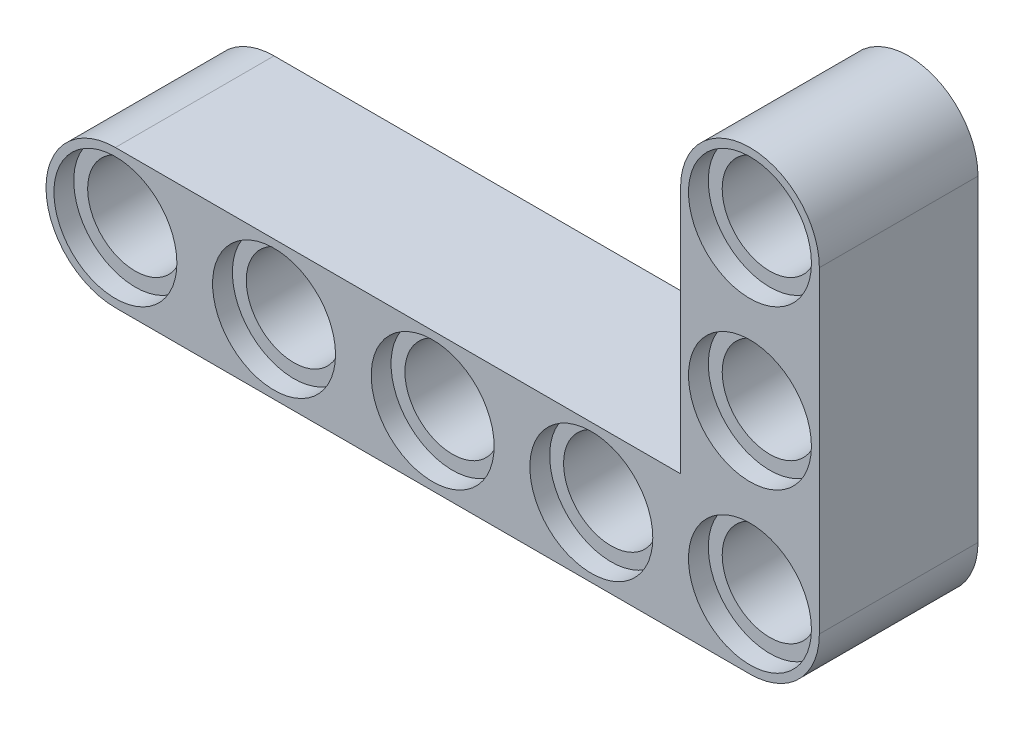
ISO-10303-21;
HEADER;
FILE_DESCRIPTION(('STEP AP214'),'2;1');
FILE_NAME('part.step','',(''),(''),'','','');
FILE_SCHEMA(('AUTOMOTIVE_DESIGN { 1 0 10303 214 1 1 1 1 }'));
ENDSEC;
DATA;
#1=APPLICATION_CONTEXT('core data for automotive mechanical design processes');
#2=APPLICATION_PROTOCOL_DEFINITION('international standard','automotive_design',2000,#1);
#3=PRODUCT_CONTEXT('',#1,'mechanical');
#4=PRODUCT('Part','Part','',(#3));
#5=PRODUCT_RELATED_PRODUCT_CATEGORY('part','',(#4));
#6=PRODUCT_DEFINITION_FORMATION('','',#4);
#7=PRODUCT_DEFINITION_CONTEXT('part definition',#1,'design');
#8=PRODUCT_DEFINITION('design','',#6,#7);
#9=PRODUCT_DEFINITION_SHAPE('','',#8);
#10=(LENGTH_UNIT() NAMED_UNIT(*) SI_UNIT(.MILLI.,.METRE.));
#11=(NAMED_UNIT(*) PLANE_ANGLE_UNIT() SI_UNIT($,.RADIAN.));
#12=(NAMED_UNIT(*) SI_UNIT($,.STERADIAN.) SOLID_ANGLE_UNIT());
#13=UNCERTAINTY_MEASURE_WITH_UNIT(LENGTH_MEASURE(1.E-05),#10,'distance_accuracy_value','');
#14=(GEOMETRIC_REPRESENTATION_CONTEXT(3) GLOBAL_UNCERTAINTY_ASSIGNED_CONTEXT((#13)) GLOBAL_UNIT_ASSIGNED_CONTEXT((#10,
#11,#12)) REPRESENTATION_CONTEXT('',''));
#15=CARTESIAN_POINT('',(0.,0.,0.));
#16=DIRECTION('',(0.,0.,1.));
#17=DIRECTION('',(1.,0.,0.));
#18=AXIS2_PLACEMENT_3D('',#15,#16,#17);
#19=CARTESIAN_POINT('',(0.,0.,4.));
#20=DIRECTION('',(0.,0.,-1.));
#21=DIRECTION('',(-1.,0.,0.));
#22=AXIS2_PLACEMENT_3D('',#19,#20,#21);
#23=CYLINDRICAL_SURFACE('',#22,2.4);
#24=CARTESIAN_POINT('',(0.,0.,3.));
#25=DIRECTION('',(0.,0.,1.));
#26=DIRECTION('',(1.,0.,0.));
#27=AXIS2_PLACEMENT_3D('',#24,#25,#26);
#28=CIRCLE('',#27,2.4);
#29=CARTESIAN_POINT('',(2.4,0.,3.));
#30=VERTEX_POINT('',#29);
#31=EDGE_CURVE('E142',#30,#30,#28,.T.);
#32=ORIENTED_EDGE('',*,*,#31,.T.);
#33=EDGE_LOOP('',(#32));
#34=FACE_BOUND('',#33,.T.);
#35=CARTESIAN_POINT('',(0.,0.,-3.));
#36=DIRECTION('',(0.,0.,-1.));
#37=DIRECTION('',(-1.,0.,0.));
#38=AXIS2_PLACEMENT_3D('',#35,#36,#37);
#39=CIRCLE('',#38,2.4);
#40=CARTESIAN_POINT('',(-2.4,0.,-3.));
#41=VERTEX_POINT('',#40);
#42=EDGE_CURVE('E43',#41,#41,#39,.T.);
#43=ORIENTED_EDGE('',*,*,#42,.T.);
#44=EDGE_LOOP('',(#43));
#45=FACE_BOUND('',#44,.T.);
#46=ADVANCED_FACE('F39',(#34,#45),#23,.F.);
#47=CARTESIAN_POINT('',(8.,0.,4.));
#48=DIRECTION('',(0.,0.,-1.));
#49=DIRECTION('',(-1.,0.,0.));
#50=AXIS2_PLACEMENT_3D('',#47,#48,#49);
#51=CYLINDRICAL_SURFACE('',#50,2.4);
#52=CARTESIAN_POINT('',(8.,0.,3.));
#53=DIRECTION('',(0.,0.,1.));
#54=DIRECTION('',(1.,0.,0.));
#55=AXIS2_PLACEMENT_3D('',#52,#53,#54);
#56=CIRCLE('',#55,2.4);
#57=CARTESIAN_POINT('',(10.4,0.,3.));
#58=VERTEX_POINT('',#57);
#59=EDGE_CURVE('E192',#58,#58,#56,.T.);
#60=ORIENTED_EDGE('',*,*,#59,.T.);
#61=EDGE_LOOP('',(#60));
#62=FACE_BOUND('',#61,.T.);
#63=CARTESIAN_POINT('',(8.,0.,-3.));
#64=DIRECTION('',(0.,0.,-1.));
#65=DIRECTION('',(-1.,0.,0.));
#66=AXIS2_PLACEMENT_3D('',#63,#64,#65);
#67=CIRCLE('',#66,2.4);
#68=CARTESIAN_POINT('',(5.6,0.,-3.));
#69=VERTEX_POINT('',#68);
#70=EDGE_CURVE('E219',#69,#69,#67,.T.);
#71=ORIENTED_EDGE('',*,*,#70,.T.);
#72=EDGE_LOOP('',(#71));
#73=FACE_BOUND('',#72,.T.);
#74=ADVANCED_FACE('F366',(#62,#73),#51,.F.);
#75=CARTESIAN_POINT('',(16.,0.,4.));
#76=DIRECTION('',(0.,0.,-1.));
#77=DIRECTION('',(-1.,0.,0.));
#78=AXIS2_PLACEMENT_3D('',#75,#76,#77);
#79=CYLINDRICAL_SURFACE('',#78,2.4);
#80=CARTESIAN_POINT('',(16.,0.,3.));
#81=DIRECTION('',(0.,0.,1.));
#82=DIRECTION('',(1.,0.,0.));
#83=AXIS2_PLACEMENT_3D('',#80,#81,#82);
#84=CIRCLE('',#83,2.4);
#85=CARTESIAN_POINT('',(18.4,0.,3.));
#86=VERTEX_POINT('',#85);
#87=EDGE_CURVE('E188',#86,#86,#84,.T.);
#88=ORIENTED_EDGE('',*,*,#87,.T.);
#89=EDGE_LOOP('',(#88));
#90=FACE_BOUND('',#89,.T.);
#91=CARTESIAN_POINT('',(16.,0.,-3.));
#92=DIRECTION('',(0.,0.,-1.));
#93=DIRECTION('',(-1.,0.,0.));
#94=AXIS2_PLACEMENT_3D('',#91,#92,#93);
#95=CIRCLE('',#94,2.4);
#96=CARTESIAN_POINT('',(13.6,0.,-3.));
#97=VERTEX_POINT('',#96);
#98=EDGE_CURVE('E216',#97,#97,#95,.T.);
#99=ORIENTED_EDGE('',*,*,#98,.T.);
#100=EDGE_LOOP('',(#99));
#101=FACE_BOUND('',#100,.T.);
#102=ADVANCED_FACE('F372',(#90,#101),#79,.F.);
#103=CARTESIAN_POINT('',(-8.,0.,4.));
#104=DIRECTION('',(0.,0.,-1.));
#105=DIRECTION('',(-1.,0.,0.));
#106=AXIS2_PLACEMENT_3D('',#103,#104,#105);
#107=CYLINDRICAL_SURFACE('',#106,2.4);
#108=CARTESIAN_POINT('',(-8.,0.,3.));
#109=DIRECTION('',(0.,0.,1.));
#110=DIRECTION('',(1.,0.,0.));
#111=AXIS2_PLACEMENT_3D('',#108,#109,#110);
#112=CIRCLE('',#111,2.4);
#113=CARTESIAN_POINT('',(-5.6,0.,3.));
#114=VERTEX_POINT('',#113);
#115=EDGE_CURVE('E184',#114,#114,#112,.T.);
#116=ORIENTED_EDGE('',*,*,#115,.T.);
#117=EDGE_LOOP('',(#116));
#118=FACE_BOUND('',#117,.T.);
#119=CARTESIAN_POINT('',(-8.,0.,-3.));
#120=DIRECTION('',(0.,0.,-1.));
#121=DIRECTION('',(-1.,0.,0.));
#122=AXIS2_PLACEMENT_3D('',#119,#120,#121);
#123=CIRCLE('',#122,2.4);
#124=CARTESIAN_POINT('',(-10.4,0.,-3.));
#125=VERTEX_POINT('',#124);
#126=EDGE_CURVE('E212',#125,#125,#123,.T.);
#127=ORIENTED_EDGE('',*,*,#126,.T.);
#128=EDGE_LOOP('',(#127));
#129=FACE_BOUND('',#128,.T.);
#130=ADVANCED_FACE('F449',(#118,#129),#107,.F.);
#131=CARTESIAN_POINT('',(-16.,0.,4.));
#132=DIRECTION('',(0.,0.,-1.));
#133=DIRECTION('',(-1.,0.,0.));
#134=AXIS2_PLACEMENT_3D('',#131,#132,#133);
#135=CYLINDRICAL_SURFACE('',#134,2.4);
#136=CARTESIAN_POINT('',(-16.,0.,3.));
#137=DIRECTION('',(0.,0.,1.));
#138=DIRECTION('',(1.,0.,0.));
#139=AXIS2_PLACEMENT_3D('',#136,#137,#138);
#140=CIRCLE('',#139,2.4);
#141=CARTESIAN_POINT('',(-13.6,0.,3.));
#142=VERTEX_POINT('',#141);
#143=EDGE_CURVE('E180',#142,#142,#140,.T.);
#144=ORIENTED_EDGE('',*,*,#143,.T.);
#145=EDGE_LOOP('',(#144));
#146=FACE_BOUND('',#145,.T.);
#147=CARTESIAN_POINT('',(-16.,0.,-3.));
#148=DIRECTION('',(0.,0.,-1.));
#149=DIRECTION('',(-1.,0.,0.));
#150=AXIS2_PLACEMENT_3D('',#147,#148,#149);
#151=CIRCLE('',#150,2.4);
#152=CARTESIAN_POINT('',(-18.4,0.,-3.));
#153=VERTEX_POINT('',#152);
#154=EDGE_CURVE('E208',#153,#153,#151,.T.);
#155=ORIENTED_EDGE('',*,*,#154,.T.);
#156=EDGE_LOOP('',(#155));
#157=FACE_BOUND('',#156,.T.);
#158=ADVANCED_FACE('F441',(#146,#157),#135,.F.);
#159=CARTESIAN_POINT('',(16.,8.,4.));
#160=DIRECTION('',(0.,0.,-1.));
#161=DIRECTION('',(-1.,0.,0.));
#162=AXIS2_PLACEMENT_3D('',#159,#160,#161);
#163=CYLINDRICAL_SURFACE('',#162,2.4);
#164=CARTESIAN_POINT('',(16.,8.,3.));
#165=DIRECTION('',(0.,0.,1.));
#166=DIRECTION('',(1.,0.,0.));
#167=AXIS2_PLACEMENT_3D('',#164,#165,#166);
#168=CIRCLE('',#167,2.4);
#169=CARTESIAN_POINT('',(18.4,8.,3.));
#170=VERTEX_POINT('',#169);
#171=EDGE_CURVE('E175',#170,#170,#168,.T.);
#172=ORIENTED_EDGE('',*,*,#171,.T.);
#173=EDGE_LOOP('',(#172));
#174=FACE_BOUND('',#173,.T.);
#175=CARTESIAN_POINT('',(16.,8.,-3.));
#176=DIRECTION('',(0.,0.,-1.));
#177=DIRECTION('',(-1.,0.,0.));
#178=AXIS2_PLACEMENT_3D('',#175,#176,#177);
#179=CIRCLE('',#178,2.4);
#180=CARTESIAN_POINT('',(13.6,8.,-3.));
#181=VERTEX_POINT('',#180);
#182=EDGE_CURVE('E203',#181,#181,#179,.T.);
#183=ORIENTED_EDGE('',*,*,#182,.T.);
#184=EDGE_LOOP('',(#183));
#185=FACE_BOUND('',#184,.T.);
#186=ADVANCED_FACE('F433',(#174,#185),#163,.F.);
#187=CARTESIAN_POINT('',(16.,16.,4.));
#188=DIRECTION('',(0.,0.,-1.));
#189=DIRECTION('',(-1.,0.,0.));
#190=AXIS2_PLACEMENT_3D('',#187,#188,#189);
#191=CYLINDRICAL_SURFACE('',#190,2.4);
#192=CARTESIAN_POINT('',(16.,16.,3.));
#193=DIRECTION('',(0.,0.,1.));
#194=DIRECTION('',(1.,0.,0.));
#195=AXIS2_PLACEMENT_3D('',#192,#193,#194);
#196=CIRCLE('',#195,2.4);
#197=CARTESIAN_POINT('',(18.4,16.,3.));
#198=VERTEX_POINT('',#197);
#199=EDGE_CURVE('E171',#198,#198,#196,.T.);
#200=ORIENTED_EDGE('',*,*,#199,.T.);
#201=EDGE_LOOP('',(#200));
#202=FACE_BOUND('',#201,.T.);
#203=CARTESIAN_POINT('',(16.,16.,-3.));
#204=DIRECTION('',(0.,0.,-1.));
#205=DIRECTION('',(-1.,0.,0.));
#206=AXIS2_PLACEMENT_3D('',#203,#204,#205);
#207=CIRCLE('',#206,2.4);
#208=CARTESIAN_POINT('',(13.6,16.,-3.));
#209=VERTEX_POINT('',#208);
#210=EDGE_CURVE('E199',#209,#209,#207,.T.);
#211=ORIENTED_EDGE('',*,*,#210,.T.);
#212=EDGE_LOOP('',(#211));
#213=FACE_BOUND('',#212,.T.);
#214=ADVANCED_FACE('F380',(#202,#213),#191,.F.);
#215=CARTESIAN_POINT('',(16.,0.,4.));
#216=DIRECTION('',(0.,0.,1.));
#217=DIRECTION('',(1.,0.,0.));
#218=AXIS2_PLACEMENT_3D('',#215,#216,#217);
#219=PLANE('',#218);
#220=CARTESIAN_POINT('',(-16.,0.,4.));
#221=DIRECTION('',(0.,0.,1.));
#222=DIRECTION('',(1.,0.,0.));
#223=AXIS2_PLACEMENT_3D('',#220,#221,#222);
#224=CIRCLE('',#223,3.1);
#225=CARTESIAN_POINT('',(-12.9,0.,4.));
#226=VERTEX_POINT('',#225);
#227=EDGE_CURVE('E251',#226,#226,#224,.T.);
#228=ORIENTED_EDGE('',*,*,#227,.F.);
#229=EDGE_LOOP('',(#228));
#230=FACE_BOUND('',#229,.T.);
#231=CARTESIAN_POINT('',(-8.,0.,4.));
#232=DIRECTION('',(0.,0.,1.));
#233=DIRECTION('',(1.,0.,0.));
#234=AXIS2_PLACEMENT_3D('',#231,#232,#233);
#235=CIRCLE('',#234,3.1);
#236=CARTESIAN_POINT('',(-4.9,0.,4.));
#237=VERTEX_POINT('',#236);
#238=EDGE_CURVE('E259',#237,#237,#235,.T.);
#239=ORIENTED_EDGE('',*,*,#238,.F.);
#240=EDGE_LOOP('',(#239));
#241=FACE_BOUND('',#240,.T.);
#242=CARTESIAN_POINT('',(0.,0.,4.));
#243=DIRECTION('',(0.,0.,1.));
#244=DIRECTION('',(1.,0.,0.));
#245=AXIS2_PLACEMENT_3D('',#242,#243,#244);
#246=CIRCLE('',#245,3.1);
#247=CARTESIAN_POINT('',(3.1,0.,4.));
#248=VERTEX_POINT('',#247);
#249=EDGE_CURVE('E267',#248,#248,#246,.T.);
#250=ORIENTED_EDGE('',*,*,#249,.F.);
#251=EDGE_LOOP('',(#250));
#252=FACE_BOUND('',#251,.T.);
#253=CARTESIAN_POINT('',(8.,0.,4.));
#254=DIRECTION('',(0.,0.,1.));
#255=DIRECTION('',(1.,0.,0.));
#256=AXIS2_PLACEMENT_3D('',#253,#254,#255);
#257=CIRCLE('',#256,3.1);
#258=CARTESIAN_POINT('',(11.1,0.,4.));
#259=VERTEX_POINT('',#258);
#260=EDGE_CURVE('E275',#259,#259,#257,.T.);
#261=ORIENTED_EDGE('',*,*,#260,.F.);
#262=EDGE_LOOP('',(#261));
#263=FACE_BOUND('',#262,.T.);
#264=CARTESIAN_POINT('',(16.,0.,4.));
#265=DIRECTION('',(0.,0.,1.));
#266=DIRECTION('',(1.,0.,0.));
#267=AXIS2_PLACEMENT_3D('',#264,#265,#266);
#268=CIRCLE('',#267,3.1);
#269=CARTESIAN_POINT('',(19.1,0.,4.));
#270=VERTEX_POINT('',#269);
#271=EDGE_CURVE('E283',#270,#270,#268,.T.);
#272=ORIENTED_EDGE('',*,*,#271,.F.);
#273=EDGE_LOOP('',(#272));
#274=FACE_BOUND('',#273,.T.);
#275=CARTESIAN_POINT('',(16.,8.,4.));
#276=DIRECTION('',(0.,0.,1.));
#277=DIRECTION('',(1.,0.,0.));
#278=AXIS2_PLACEMENT_3D('',#275,#276,#277);
#279=CIRCLE('',#278,3.1);
#280=CARTESIAN_POINT('',(19.1,8.,4.));
#281=VERTEX_POINT('',#280);
#282=EDGE_CURVE('E237',#281,#281,#279,.T.);
#283=ORIENTED_EDGE('',*,*,#282,.F.);
#284=EDGE_LOOP('',(#283));
#285=FACE_BOUND('',#284,.T.);
#286=CARTESIAN_POINT('',(16.,16.,4.));
#287=DIRECTION('',(0.,0.,1.));
#288=DIRECTION('',(1.,0.,0.));
#289=AXIS2_PLACEMENT_3D('',#286,#287,#288);
#290=CIRCLE('',#289,3.1);
#291=CARTESIAN_POINT('',(19.1,16.,4.));
#292=VERTEX_POINT('',#291);
#293=EDGE_CURVE('E226',#292,#292,#290,.T.);
#294=ORIENTED_EDGE('',*,*,#293,.F.);
#295=EDGE_LOOP('',(#294));
#296=FACE_BOUND('',#295,.T.);
#297=CARTESIAN_POINT('',(16.,0.,4.));
#298=DIRECTION('',(0.,0.,1.));
#299=DIRECTION('',(1.,0.,0.));
#300=AXIS2_PLACEMENT_3D('',#297,#298,#299);
#301=CIRCLE('',#300,3.5);
#302=CARTESIAN_POINT('',(16.,-3.5,4.));
#303=VERTEX_POINT('',#302);
#304=CARTESIAN_POINT('',(19.5,0.,4.));
#305=VERTEX_POINT('',#304);
#306=EDGE_CURVE('E157',#303,#305,#301,.T.);
#307=ORIENTED_EDGE('',*,*,#306,.T.);
#308=DIRECTION('',(0.,1.,0.));
#309=VECTOR('',#308,1.);
#310=CARTESIAN_POINT('',(19.5,16.,4.));
#311=LINE('',#310,#309);
#312=CARTESIAN_POINT('',(19.5,16.,4.));
#313=VERTEX_POINT('',#312);
#314=EDGE_CURVE('E99',#305,#313,#311,.T.);
#315=ORIENTED_EDGE('',*,*,#314,.T.);
#316=CARTESIAN_POINT('',(16.,16.,4.));
#317=DIRECTION('',(0.,0.,1.));
#318=DIRECTION('',(-1.,0.,0.));
#319=AXIS2_PLACEMENT_3D('',#316,#317,#318);
#320=CIRCLE('',#319,3.5);
#321=CARTESIAN_POINT('',(12.5,16.,4.));
#322=VERTEX_POINT('',#321);
#323=EDGE_CURVE('E245',#313,#322,#320,.T.);
#324=ORIENTED_EDGE('',*,*,#323,.T.);
#325=DIRECTION('',(0.,-1.,0.));
#326=VECTOR('',#325,1.);
#327=CARTESIAN_POINT('',(12.5,16.,4.));
#328=LINE('',#327,#326);
#329=CARTESIAN_POINT('',(12.5,3.5,4.));
#330=VERTEX_POINT('',#329);
#331=EDGE_CURVE('E115',#322,#330,#328,.T.);
#332=ORIENTED_EDGE('',*,*,#331,.T.);
#333=DIRECTION('',(-1.,0.,0.));
#334=VECTOR('',#333,1.);
#335=CARTESIAN_POINT('',(-16.,3.5,4.));
#336=LINE('',#335,#334);
#337=CARTESIAN_POINT('',(-16.,3.5,4.));
#338=VERTEX_POINT('',#337);
#339=EDGE_CURVE('E109',#330,#338,#336,.T.);
#340=ORIENTED_EDGE('',*,*,#339,.T.);
#341=CARTESIAN_POINT('',(-16.,0.,4.));
#342=DIRECTION('',(0.,0.,1.));
#343=DIRECTION('',(1.,0.,0.));
#344=AXIS2_PLACEMENT_3D('',#341,#342,#343);
#345=CIRCLE('',#344,3.5);
#346=CARTESIAN_POINT('',(-16.,-3.5,4.));
#347=VERTEX_POINT('',#346);
#348=EDGE_CURVE('E113',#338,#347,#345,.T.);
#349=ORIENTED_EDGE('',*,*,#348,.T.);
#350=DIRECTION('',(1.,0.,0.));
#351=VECTOR('',#350,1.);
#352=CARTESIAN_POINT('',(-16.,-3.5,4.));
#353=LINE('',#352,#351);
#354=EDGE_CURVE('E59',#347,#303,#353,.T.);
#355=ORIENTED_EDGE('',*,*,#354,.T.);
#356=EDGE_LOOP('',(#307,#315,#324,#332,#340,#349,#355));
#357=FACE_BOUND('',#356,.T.);
#358=ADVANCED_FACE('F111',(#230,#241,#252,#263,#274,#285,#296,#357),#219,.T.);
#359=CARTESIAN_POINT('',(16.,0.,-4.));
#360=DIRECTION('',(0.,0.,1.));
#361=DIRECTION('',(1.,0.,0.));
#362=AXIS2_PLACEMENT_3D('',#359,#360,#361);
#363=PLANE('',#362);
#364=CARTESIAN_POINT('',(-16.,0.,-4.));
#365=DIRECTION('',(0.,0.,1.));
#366=DIRECTION('',(1.,0.,0.));
#367=AXIS2_PLACEMENT_3D('',#364,#365,#366);
#368=CIRCLE('',#367,3.1);
#369=CARTESIAN_POINT('',(-12.9,0.,-4.));
#370=VERTEX_POINT('',#369);
#371=EDGE_CURVE('E344',#370,#370,#368,.T.);
#372=ORIENTED_EDGE('',*,*,#371,.T.);
#373=EDGE_LOOP('',(#372));
#374=FACE_BOUND('',#373,.T.);
#375=CARTESIAN_POINT('',(-8.,0.,-4.));
#376=DIRECTION('',(0.,0.,1.));
#377=DIRECTION('',(1.,0.,0.));
#378=AXIS2_PLACEMENT_3D('',#375,#376,#377);
#379=CIRCLE('',#378,3.1);
#380=CARTESIAN_POINT('',(-4.9,0.,-4.));
#381=VERTEX_POINT('',#380);
#382=EDGE_CURVE('E336',#381,#381,#379,.T.);
#383=ORIENTED_EDGE('',*,*,#382,.T.);
#384=EDGE_LOOP('',(#383));
#385=FACE_BOUND('',#384,.T.);
#386=CARTESIAN_POINT('',(0.,0.,-4.));
#387=DIRECTION('',(0.,0.,1.));
#388=DIRECTION('',(1.,0.,0.));
#389=AXIS2_PLACEMENT_3D('',#386,#387,#388);
#390=CIRCLE('',#389,3.1);
#391=CARTESIAN_POINT('',(3.1,0.,-4.));
#392=VERTEX_POINT('',#391);
#393=EDGE_CURVE('E328',#392,#392,#390,.T.);
#394=ORIENTED_EDGE('',*,*,#393,.T.);
#395=EDGE_LOOP('',(#394));
#396=FACE_BOUND('',#395,.T.);
#397=CARTESIAN_POINT('',(8.,0.,-4.));
#398=DIRECTION('',(0.,0.,1.));
#399=DIRECTION('',(1.,0.,0.));
#400=AXIS2_PLACEMENT_3D('',#397,#398,#399);
#401=CIRCLE('',#400,3.1);
#402=CARTESIAN_POINT('',(11.1,0.,-4.));
#403=VERTEX_POINT('',#402);
#404=EDGE_CURVE('E320',#403,#403,#401,.T.);
#405=ORIENTED_EDGE('',*,*,#404,.T.);
#406=EDGE_LOOP('',(#405));
#407=FACE_BOUND('',#406,.T.);
#408=CARTESIAN_POINT('',(16.,0.,-4.));
#409=DIRECTION('',(0.,0.,1.));
#410=DIRECTION('',(1.,0.,0.));
#411=AXIS2_PLACEMENT_3D('',#408,#409,#410);
#412=CIRCLE('',#411,3.1);
#413=CARTESIAN_POINT('',(19.1,0.,-4.));
#414=VERTEX_POINT('',#413);
#415=EDGE_CURVE('E312',#414,#414,#412,.T.);
#416=ORIENTED_EDGE('',*,*,#415,.T.);
#417=EDGE_LOOP('',(#416));
#418=FACE_BOUND('',#417,.T.);
#419=CARTESIAN_POINT('',(16.,8.,-4.));
#420=DIRECTION('',(0.,0.,1.));
#421=DIRECTION('',(1.,0.,0.));
#422=AXIS2_PLACEMENT_3D('',#419,#420,#421);
#423=CIRCLE('',#422,3.1);
#424=CARTESIAN_POINT('',(19.1,8.,-4.));
#425=VERTEX_POINT('',#424);
#426=EDGE_CURVE('E304',#425,#425,#423,.T.);
#427=ORIENTED_EDGE('',*,*,#426,.T.);
#428=EDGE_LOOP('',(#427));
#429=FACE_BOUND('',#428,.T.);
#430=CARTESIAN_POINT('',(16.,16.,-4.));
#431=DIRECTION('',(0.,0.,1.));
#432=DIRECTION('',(1.,0.,0.));
#433=AXIS2_PLACEMENT_3D('',#430,#431,#432);
#434=CIRCLE('',#433,3.1);
#435=CARTESIAN_POINT('',(19.1,16.,-4.));
#436=VERTEX_POINT('',#435);
#437=EDGE_CURVE('E296',#436,#436,#434,.T.);
#438=ORIENTED_EDGE('',*,*,#437,.T.);
#439=EDGE_LOOP('',(#438));
#440=FACE_BOUND('',#439,.T.);
#441=CARTESIAN_POINT('',(16.,0.,-4.));
#442=DIRECTION('',(0.,0.,1.));
#443=DIRECTION('',(1.,0.,0.));
#444=AXIS2_PLACEMENT_3D('',#441,#442,#443);
#445=CIRCLE('',#444,3.5);
#446=CARTESIAN_POINT('',(16.,-3.5,-4.));
#447=VERTEX_POINT('',#446);
#448=CARTESIAN_POINT('',(19.5,0.,-4.));
#449=VERTEX_POINT('',#448);
#450=EDGE_CURVE('E137',#447,#449,#445,.T.);
#451=ORIENTED_EDGE('',*,*,#450,.F.);
#452=DIRECTION('',(1.,0.,0.));
#453=VECTOR('',#452,1.);
#454=CARTESIAN_POINT('',(-16.,-3.5,-4.));
#455=LINE('',#454,#453);
#456=CARTESIAN_POINT('',(-16.,-3.5,-4.));
#457=VERTEX_POINT('',#456);
#458=EDGE_CURVE('E91',#457,#447,#455,.T.);
#459=ORIENTED_EDGE('',*,*,#458,.F.);
#460=CARTESIAN_POINT('',(-16.,0.,-4.));
#461=DIRECTION('',(0.,0.,1.));
#462=DIRECTION('',(1.,0.,0.));
#463=AXIS2_PLACEMENT_3D('',#460,#461,#462);
#464=CIRCLE('',#463,3.5);
#465=CARTESIAN_POINT('',(-16.,3.5,-4.));
#466=VERTEX_POINT('',#465);
#467=EDGE_CURVE('E85',#466,#457,#464,.T.);
#468=ORIENTED_EDGE('',*,*,#467,.F.);
#469=DIRECTION('',(-1.,0.,0.));
#470=VECTOR('',#469,1.);
#471=CARTESIAN_POINT('',(-16.,3.5,-4.));
#472=LINE('',#471,#470);
#473=CARTESIAN_POINT('',(12.5,3.5,-4.));
#474=VERTEX_POINT('',#473);
#475=EDGE_CURVE('E124',#474,#466,#472,.T.);
#476=ORIENTED_EDGE('',*,*,#475,.F.);
#477=DIRECTION('',(0.,-1.,0.));
#478=VECTOR('',#477,1.);
#479=CARTESIAN_POINT('',(12.5,16.,-4.));
#480=LINE('',#479,#478);
#481=CARTESIAN_POINT('',(12.5,16.,-4.));
#482=VERTEX_POINT('',#481);
#483=EDGE_CURVE('E148',#482,#474,#480,.T.);
#484=ORIENTED_EDGE('',*,*,#483,.F.);
#485=CARTESIAN_POINT('',(16.,16.,-4.));
#486=DIRECTION('',(0.,0.,1.));
#487=DIRECTION('',(-1.,0.,0.));
#488=AXIS2_PLACEMENT_3D('',#485,#486,#487);
#489=CIRCLE('',#488,3.5);
#490=CARTESIAN_POINT('',(19.5,16.,-4.));
#491=VERTEX_POINT('',#490);
#492=EDGE_CURVE('E145',#491,#482,#489,.T.);
#493=ORIENTED_EDGE('',*,*,#492,.F.);
#494=DIRECTION('',(0.,1.,0.));
#495=VECTOR('',#494,1.);
#496=CARTESIAN_POINT('',(19.5,16.,-4.));
#497=LINE('',#496,#495);
#498=EDGE_CURVE('E141',#449,#491,#497,.T.);
#499=ORIENTED_EDGE('',*,*,#498,.F.);
#500=EDGE_LOOP('',(#451,#459,#468,#476,#484,#493,#499));
#501=FACE_BOUND('',#500,.T.);
#502=ADVANCED_FACE('F379',(#374,#385,#396,#407,#418,#429,#440,#501),#363,.F.);
#503=CARTESIAN_POINT('',(16.,0.,4.));
#504=DIRECTION('',(0.,0.,-1.));
#505=DIRECTION('',(-1.,0.,0.));
#506=AXIS2_PLACEMENT_3D('',#503,#504,#505);
#507=CYLINDRICAL_SURFACE('',#506,3.5);
#508=ORIENTED_EDGE('',*,*,#450,.T.);
#509=DIRECTION('',(0.,0.,-1.));
#510=VECTOR('',#509,1.);
#511=CARTESIAN_POINT('',(19.5,0.,4.));
#512=LINE('',#511,#510);
#513=EDGE_CURVE('E11',#305,#449,#512,.T.);
#514=ORIENTED_EDGE('',*,*,#513,.F.);
#515=ORIENTED_EDGE('',*,*,#306,.F.);
#516=DIRECTION('',(0.,0.,-1.));
#517=VECTOR('',#516,1.);
#518=CARTESIAN_POINT('',(16.,-3.5,4.));
#519=LINE('',#518,#517);
#520=EDGE_CURVE('E133',#303,#447,#519,.T.);
#521=ORIENTED_EDGE('',*,*,#520,.T.);
#522=EDGE_LOOP('',(#508,#514,#515,#521));
#523=FACE_BOUND('',#522,.T.);
#524=ADVANCED_FACE('F41',(#523),#507,.T.);
#525=CARTESIAN_POINT('',(19.5,16.,4.));
#526=DIRECTION('',(-1.,0.,0.));
#527=DIRECTION('',(0.,0.,1.));
#528=AXIS2_PLACEMENT_3D('',#525,#526,#527);
#529=PLANE('',#528);
#530=ORIENTED_EDGE('',*,*,#498,.T.);
#531=DIRECTION('',(0.,0.,-1.));
#532=VECTOR('',#531,1.);
#533=CARTESIAN_POINT('',(19.5,16.,4.));
#534=LINE('',#533,#532);
#535=EDGE_CURVE('E50',#313,#491,#534,.T.);
#536=ORIENTED_EDGE('',*,*,#535,.F.);
#537=ORIENTED_EDGE('',*,*,#314,.F.);
#538=ORIENTED_EDGE('',*,*,#513,.T.);
#539=EDGE_LOOP('',(#530,#536,#537,#538));
#540=FACE_BOUND('',#539,.T.);
#541=ADVANCED_FACE('F399',(#540),#529,.F.);
#542=CARTESIAN_POINT('',(16.,16.,4.));
#543=DIRECTION('',(0.,0.,-1.));
#544=DIRECTION('',(-1.,0.,0.));
#545=AXIS2_PLACEMENT_3D('',#542,#543,#544);
#546=CYLINDRICAL_SURFACE('',#545,3.5);
#547=ORIENTED_EDGE('',*,*,#492,.T.);
#548=DIRECTION('',(0.,0.,-1.));
#549=VECTOR('',#548,1.);
#550=CARTESIAN_POINT('',(12.5,16.,4.));
#551=LINE('',#550,#549);
#552=EDGE_CURVE('E164',#322,#482,#551,.T.);
#553=ORIENTED_EDGE('',*,*,#552,.F.);
#554=ORIENTED_EDGE('',*,*,#323,.F.);
#555=ORIENTED_EDGE('',*,*,#535,.T.);
#556=EDGE_LOOP('',(#547,#553,#554,#555));
#557=FACE_BOUND('',#556,.T.);
#558=ADVANCED_FACE('F396',(#557),#546,.T.);
#559=CARTESIAN_POINT('',(12.5,16.,4.));
#560=DIRECTION('',(1.,0.,0.));
#561=DIRECTION('',(0.,0.,-1.));
#562=AXIS2_PLACEMENT_3D('',#559,#560,#561);
#563=PLANE('',#562);
#564=ORIENTED_EDGE('',*,*,#483,.T.);
#565=DIRECTION('',(0.,0.,-1.));
#566=VECTOR('',#565,1.);
#567=CARTESIAN_POINT('',(12.5,3.5,4.));
#568=LINE('',#567,#566);
#569=EDGE_CURVE('E126',#330,#474,#568,.T.);
#570=ORIENTED_EDGE('',*,*,#569,.F.);
#571=ORIENTED_EDGE('',*,*,#331,.F.);
#572=ORIENTED_EDGE('',*,*,#552,.T.);
#573=EDGE_LOOP('',(#564,#570,#571,#572));
#574=FACE_BOUND('',#573,.T.);
#575=ADVANCED_FACE('F393',(#574),#563,.F.);
#576=CARTESIAN_POINT('',(-16.,3.5,4.));
#577=DIRECTION('',(0.,-1.,0.));
#578=DIRECTION('',(1.,0.,0.));
#579=AXIS2_PLACEMENT_3D('',#576,#577,#578);
#580=PLANE('',#579);
#581=ORIENTED_EDGE('',*,*,#475,.T.);
#582=DIRECTION('',(0.,0.,-1.));
#583=VECTOR('',#582,1.);
#584=CARTESIAN_POINT('',(-16.,3.5,4.));
#585=LINE('',#584,#583);
#586=EDGE_CURVE('E121',#338,#466,#585,.T.);
#587=ORIENTED_EDGE('',*,*,#586,.F.);
#588=ORIENTED_EDGE('',*,*,#339,.F.);
#589=ORIENTED_EDGE('',*,*,#569,.T.);
#590=EDGE_LOOP('',(#581,#587,#588,#589));
#591=FACE_BOUND('',#590,.T.);
#592=ADVANCED_FACE('F122',(#591),#580,.F.);
#593=CARTESIAN_POINT('',(-16.,0.,4.));
#594=DIRECTION('',(0.,0.,-1.));
#595=DIRECTION('',(-1.,0.,0.));
#596=AXIS2_PLACEMENT_3D('',#593,#594,#595);
#597=CYLINDRICAL_SURFACE('',#596,3.5);
#598=ORIENTED_EDGE('',*,*,#467,.T.);
#599=DIRECTION('',(0.,0.,-1.));
#600=VECTOR('',#599,1.);
#601=CARTESIAN_POINT('',(-16.,-3.5,4.));
#602=LINE('',#601,#600);
#603=EDGE_CURVE('E127',#347,#457,#602,.T.);
#604=ORIENTED_EDGE('',*,*,#603,.F.);
#605=ORIENTED_EDGE('',*,*,#348,.F.);
#606=ORIENTED_EDGE('',*,*,#586,.T.);
#607=EDGE_LOOP('',(#598,#604,#605,#606));
#608=FACE_BOUND('',#607,.T.);
#609=ADVANCED_FACE('F129',(#608),#597,.T.);
#610=CARTESIAN_POINT('',(-16.,-3.5,4.));
#611=DIRECTION('',(0.,1.,0.));
#612=DIRECTION('',(-1.,0.,0.));
#613=AXIS2_PLACEMENT_3D('',#610,#611,#612);
#614=PLANE('',#613);
#615=ORIENTED_EDGE('',*,*,#458,.T.);
#616=ORIENTED_EDGE('',*,*,#520,.F.);
#617=ORIENTED_EDGE('',*,*,#354,.F.);
#618=ORIENTED_EDGE('',*,*,#603,.T.);
#619=EDGE_LOOP('',(#615,#616,#617,#618));
#620=FACE_BOUND('',#619,.T.);
#621=ADVANCED_FACE('F385',(#620),#614,.F.);
#622=CARTESIAN_POINT('',(16.,16.,3.));
#623=DIRECTION('',(0.,0.,1.));
#624=DIRECTION('',(1.,0.,0.));
#625=AXIS2_PLACEMENT_3D('',#622,#623,#624);
#626=CYLINDRICAL_SURFACE('',#625,3.1);
#627=CARTESIAN_POINT('',(16.,16.,3.));
#628=DIRECTION('',(0.,0.,1.));
#629=DIRECTION('',(1.,0.,0.));
#630=AXIS2_PLACEMENT_3D('',#627,#628,#629);
#631=CIRCLE('',#630,3.1);
#632=CARTESIAN_POINT('',(19.1,16.,3.));
#633=VERTEX_POINT('',#632);
#634=EDGE_CURVE('E231',#633,#633,#631,.T.);
#635=ORIENTED_EDGE('',*,*,#634,.F.);
#636=EDGE_LOOP('',(#635));
#637=FACE_BOUND('',#636,.T.);
#638=ORIENTED_EDGE('',*,*,#293,.T.);
#639=EDGE_LOOP('',(#638));
#640=FACE_BOUND('',#639,.T.);
#641=ADVANCED_FACE('F388',(#637,#640),#626,.F.);
#642=CARTESIAN_POINT('',(16.,16.,3.));
#643=DIRECTION('',(0.,0.,1.));
#644=DIRECTION('',(1.,0.,0.));
#645=AXIS2_PLACEMENT_3D('',#642,#643,#644);
#646=PLANE('',#645);
#647=ORIENTED_EDGE('',*,*,#199,.F.);
#648=EDGE_LOOP('',(#647));
#649=FACE_BOUND('',#648,.T.);
#650=ORIENTED_EDGE('',*,*,#634,.T.);
#651=EDGE_LOOP('',(#650));
#652=FACE_BOUND('',#651,.T.);
#653=ADVANCED_FACE('F595',(#649,#652),#646,.T.);
#654=CARTESIAN_POINT('',(16.,8.,3.));
#655=DIRECTION('',(0.,0.,1.));
#656=DIRECTION('',(1.,0.,0.));
#657=AXIS2_PLACEMENT_3D('',#654,#655,#656);
#658=CYLINDRICAL_SURFACE('',#657,3.1);
#659=CARTESIAN_POINT('',(16.,8.,3.));
#660=DIRECTION('',(0.,0.,1.));
#661=DIRECTION('',(1.,0.,0.));
#662=AXIS2_PLACEMENT_3D('',#659,#660,#661);
#663=CIRCLE('',#662,3.1);
#664=CARTESIAN_POINT('',(19.1,8.,3.));
#665=VERTEX_POINT('',#664);
#666=EDGE_CURVE('E287',#665,#665,#663,.T.);
#667=ORIENTED_EDGE('',*,*,#666,.F.);
#668=EDGE_LOOP('',(#667));
#669=FACE_BOUND('',#668,.T.);
#670=ORIENTED_EDGE('',*,*,#282,.T.);
#671=EDGE_LOOP('',(#670));
#672=FACE_BOUND('',#671,.T.);
#673=ADVANCED_FACE('F585',(#669,#672),#658,.F.);
#674=CARTESIAN_POINT('',(16.,8.,3.));
#675=DIRECTION('',(0.,0.,1.));
#676=DIRECTION('',(1.,0.,0.));
#677=AXIS2_PLACEMENT_3D('',#674,#675,#676);
#678=PLANE('',#677);
#679=ORIENTED_EDGE('',*,*,#171,.F.);
#680=EDGE_LOOP('',(#679));
#681=FACE_BOUND('',#680,.T.);
#682=ORIENTED_EDGE('',*,*,#666,.T.);
#683=EDGE_LOOP('',(#682));
#684=FACE_BOUND('',#683,.T.);
#685=ADVANCED_FACE('F575',(#681,#684),#678,.T.);
#686=CARTESIAN_POINT('',(-16.,0.,3.));
#687=DIRECTION('',(0.,0.,1.));
#688=DIRECTION('',(1.,0.,0.));
#689=AXIS2_PLACEMENT_3D('',#686,#687,#688);
#690=CYLINDRICAL_SURFACE('',#689,3.1);
#691=CARTESIAN_POINT('',(-16.,0.,3.));
#692=DIRECTION('',(0.,0.,1.));
#693=DIRECTION('',(1.,0.,0.));
#694=AXIS2_PLACEMENT_3D('',#691,#692,#693);
#695=CIRCLE('',#694,3.1);
#696=CARTESIAN_POINT('',(-12.9,0.,3.));
#697=VERTEX_POINT('',#696);
#698=EDGE_CURVE('E176',#697,#697,#695,.T.);
#699=ORIENTED_EDGE('',*,*,#698,.F.);
#700=EDGE_LOOP('',(#699));
#701=FACE_BOUND('',#700,.T.);
#702=ORIENTED_EDGE('',*,*,#227,.T.);
#703=EDGE_LOOP('',(#702));
#704=FACE_BOUND('',#703,.T.);
#705=ADVANCED_FACE('F565',(#701,#704),#690,.F.);
#706=CARTESIAN_POINT('',(-16.,0.,3.));
#707=DIRECTION('',(0.,0.,1.));
#708=DIRECTION('',(1.,0.,0.));
#709=AXIS2_PLACEMENT_3D('',#706,#707,#708);
#710=PLANE('',#709);
#711=ORIENTED_EDGE('',*,*,#143,.F.);
#712=EDGE_LOOP('',(#711));
#713=FACE_BOUND('',#712,.T.);
#714=ORIENTED_EDGE('',*,*,#698,.T.);
#715=EDGE_LOOP('',(#714));
#716=FACE_BOUND('',#715,.T.);
#717=ADVANCED_FACE('F555',(#713,#716),#710,.T.);
#718=CARTESIAN_POINT('',(-8.,0.,3.));
#719=DIRECTION('',(0.,0.,1.));
#720=DIRECTION('',(1.,0.,0.));
#721=AXIS2_PLACEMENT_3D('',#718,#719,#720);
#722=CYLINDRICAL_SURFACE('',#721,3.1);
#723=CARTESIAN_POINT('',(-8.,0.,3.));
#724=DIRECTION('',(0.,0.,1.));
#725=DIRECTION('',(1.,0.,0.));
#726=AXIS2_PLACEMENT_3D('',#723,#724,#725);
#727=CIRCLE('',#726,3.1);
#728=CARTESIAN_POINT('',(-4.9,0.,3.));
#729=VERTEX_POINT('',#728);
#730=EDGE_CURVE('E255',#729,#729,#727,.T.);
#731=ORIENTED_EDGE('',*,*,#730,.F.);
#732=EDGE_LOOP('',(#731));
#733=FACE_BOUND('',#732,.T.);
#734=ORIENTED_EDGE('',*,*,#238,.T.);
#735=EDGE_LOOP('',(#734));
#736=FACE_BOUND('',#735,.T.);
#737=ADVANCED_FACE('F545',(#733,#736),#722,.F.);
#738=CARTESIAN_POINT('',(-8.,0.,3.));
#739=DIRECTION('',(0.,0.,1.));
#740=DIRECTION('',(1.,0.,0.));
#741=AXIS2_PLACEMENT_3D('',#738,#739,#740);
#742=PLANE('',#741);
#743=ORIENTED_EDGE('',*,*,#115,.F.);
#744=EDGE_LOOP('',(#743));
#745=FACE_BOUND('',#744,.T.);
#746=ORIENTED_EDGE('',*,*,#730,.T.);
#747=EDGE_LOOP('',(#746));
#748=FACE_BOUND('',#747,.T.);
#749=ADVANCED_FACE('F535',(#745,#748),#742,.T.);
#750=CARTESIAN_POINT('',(16.,0.,3.));
#751=DIRECTION('',(0.,0.,1.));
#752=DIRECTION('',(1.,0.,0.));
#753=AXIS2_PLACEMENT_3D('',#750,#751,#752);
#754=CYLINDRICAL_SURFACE('',#753,3.1);
#755=CARTESIAN_POINT('',(16.,0.,3.));
#756=DIRECTION('',(0.,0.,1.));
#757=DIRECTION('',(1.,0.,0.));
#758=AXIS2_PLACEMENT_3D('',#755,#756,#757);
#759=CIRCLE('',#758,3.1);
#760=CARTESIAN_POINT('',(19.1,0.,3.));
#761=VERTEX_POINT('',#760);
#762=EDGE_CURVE('E279',#761,#761,#759,.T.);
#763=ORIENTED_EDGE('',*,*,#762,.F.);
#764=EDGE_LOOP('',(#763));
#765=FACE_BOUND('',#764,.T.);
#766=ORIENTED_EDGE('',*,*,#271,.T.);
#767=EDGE_LOOP('',(#766));
#768=FACE_BOUND('',#767,.T.);
#769=ADVANCED_FACE('F525',(#765,#768),#754,.F.);
#770=CARTESIAN_POINT('',(16.,0.,3.));
#771=DIRECTION('',(0.,0.,1.));
#772=DIRECTION('',(1.,0.,0.));
#773=AXIS2_PLACEMENT_3D('',#770,#771,#772);
#774=PLANE('',#773);
#775=ORIENTED_EDGE('',*,*,#87,.F.);
#776=EDGE_LOOP('',(#775));
#777=FACE_BOUND('',#776,.T.);
#778=ORIENTED_EDGE('',*,*,#762,.T.);
#779=EDGE_LOOP('',(#778));
#780=FACE_BOUND('',#779,.T.);
#781=ADVANCED_FACE('F515',(#777,#780),#774,.T.);
#782=CARTESIAN_POINT('',(8.,0.,3.));
#783=DIRECTION('',(0.,0.,1.));
#784=DIRECTION('',(1.,0.,0.));
#785=AXIS2_PLACEMENT_3D('',#782,#783,#784);
#786=CYLINDRICAL_SURFACE('',#785,3.1);
#787=CARTESIAN_POINT('',(8.,0.,3.));
#788=DIRECTION('',(0.,0.,1.));
#789=DIRECTION('',(1.,0.,0.));
#790=AXIS2_PLACEMENT_3D('',#787,#788,#789);
#791=CIRCLE('',#790,3.1);
#792=CARTESIAN_POINT('',(11.1,0.,3.));
#793=VERTEX_POINT('',#792);
#794=EDGE_CURVE('E271',#793,#793,#791,.T.);
#795=ORIENTED_EDGE('',*,*,#794,.F.);
#796=EDGE_LOOP('',(#795));
#797=FACE_BOUND('',#796,.T.);
#798=ORIENTED_EDGE('',*,*,#260,.T.);
#799=EDGE_LOOP('',(#798));
#800=FACE_BOUND('',#799,.T.);
#801=ADVANCED_FACE('F505',(#797,#800),#786,.F.);
#802=CARTESIAN_POINT('',(8.,0.,3.));
#803=DIRECTION('',(0.,0.,1.));
#804=DIRECTION('',(1.,0.,0.));
#805=AXIS2_PLACEMENT_3D('',#802,#803,#804);
#806=PLANE('',#805);
#807=ORIENTED_EDGE('',*,*,#59,.F.);
#808=EDGE_LOOP('',(#807));
#809=FACE_BOUND('',#808,.T.);
#810=ORIENTED_EDGE('',*,*,#794,.T.);
#811=EDGE_LOOP('',(#810));
#812=FACE_BOUND('',#811,.T.);
#813=ADVANCED_FACE('F495',(#809,#812),#806,.T.);
#814=CARTESIAN_POINT('',(0.,0.,3.));
#815=DIRECTION('',(0.,0.,1.));
#816=DIRECTION('',(1.,0.,0.));
#817=AXIS2_PLACEMENT_3D('',#814,#815,#816);
#818=CYLINDRICAL_SURFACE('',#817,3.1);
#819=CARTESIAN_POINT('',(0.,0.,3.));
#820=DIRECTION('',(0.,0.,1.));
#821=DIRECTION('',(1.,0.,0.));
#822=AXIS2_PLACEMENT_3D('',#819,#820,#821);
#823=CIRCLE('',#822,3.1);
#824=CARTESIAN_POINT('',(3.1,0.,3.));
#825=VERTEX_POINT('',#824);
#826=EDGE_CURVE('E263',#825,#825,#823,.T.);
#827=ORIENTED_EDGE('',*,*,#826,.F.);
#828=EDGE_LOOP('',(#827));
#829=FACE_BOUND('',#828,.T.);
#830=ORIENTED_EDGE('',*,*,#249,.T.);
#831=EDGE_LOOP('',(#830));
#832=FACE_BOUND('',#831,.T.);
#833=ADVANCED_FACE('F484',(#829,#832),#818,.F.);
#834=CARTESIAN_POINT('',(0.,0.,3.));
#835=DIRECTION('',(0.,0.,1.));
#836=DIRECTION('',(1.,0.,0.));
#837=AXIS2_PLACEMENT_3D('',#834,#835,#836);
#838=PLANE('',#837);
#839=ORIENTED_EDGE('',*,*,#31,.F.);
#840=EDGE_LOOP('',(#839));
#841=FACE_BOUND('',#840,.T.);
#842=ORIENTED_EDGE('',*,*,#826,.T.);
#843=EDGE_LOOP('',(#842));
#844=FACE_BOUND('',#843,.T.);
#845=ADVANCED_FACE('F478',(#841,#844),#838,.T.);
#846=CARTESIAN_POINT('',(16.,16.,-3.));
#847=DIRECTION('',(0.,0.,-1.));
#848=DIRECTION('',(-1.,0.,0.));
#849=AXIS2_PLACEMENT_3D('',#846,#847,#848);
#850=CYLINDRICAL_SURFACE('',#849,3.1);
#851=CARTESIAN_POINT('',(16.,16.,-3.));
#852=DIRECTION('',(0.,0.,1.));
#853=DIRECTION('',(1.,0.,0.));
#854=AXIS2_PLACEMENT_3D('',#851,#852,#853);
#855=CIRCLE('',#854,3.1);
#856=CARTESIAN_POINT('',(19.1,16.,-3.));
#857=VERTEX_POINT('',#856);
#858=EDGE_CURVE('E300',#857,#857,#855,.T.);
#859=ORIENTED_EDGE('',*,*,#858,.T.);
#860=EDGE_LOOP('',(#859));
#861=FACE_BOUND('',#860,.T.);
#862=ORIENTED_EDGE('',*,*,#437,.F.);
#863=EDGE_LOOP('',(#862));
#864=FACE_BOUND('',#863,.T.);
#865=ADVANCED_FACE('F483',(#861,#864),#850,.F.);
#866=CARTESIAN_POINT('',(16.,16.,-3.));
#867=DIRECTION('',(0.,0.,-1.));
#868=DIRECTION('',(1.,0.,0.));
#869=AXIS2_PLACEMENT_3D('',#866,#867,#868);
#870=PLANE('',#869);
#871=ORIENTED_EDGE('',*,*,#210,.F.);
#872=EDGE_LOOP('',(#871));
#873=FACE_BOUND('',#872,.T.);
#874=ORIENTED_EDGE('',*,*,#858,.F.);
#875=EDGE_LOOP('',(#874));
#876=FACE_BOUND('',#875,.T.);
#877=ADVANCED_FACE('F659',(#873,#876),#870,.T.);
#878=CARTESIAN_POINT('',(16.,8.,-3.));
#879=DIRECTION('',(0.,0.,-1.));
#880=DIRECTION('',(-1.,0.,0.));
#881=AXIS2_PLACEMENT_3D('',#878,#879,#880);
#882=CYLINDRICAL_SURFACE('',#881,3.1);
#883=CARTESIAN_POINT('',(16.,8.,-3.));
#884=DIRECTION('',(0.,0.,1.));
#885=DIRECTION('',(1.,0.,0.));
#886=AXIS2_PLACEMENT_3D('',#883,#884,#885);
#887=CIRCLE('',#886,3.1);
#888=CARTESIAN_POINT('',(19.1,8.,-3.));
#889=VERTEX_POINT('',#888);
#890=EDGE_CURVE('E308',#889,#889,#887,.T.);
#891=ORIENTED_EDGE('',*,*,#890,.T.);
#892=EDGE_LOOP('',(#891));
#893=FACE_BOUND('',#892,.T.);
#894=ORIENTED_EDGE('',*,*,#426,.F.);
#895=EDGE_LOOP('',(#894));
#896=FACE_BOUND('',#895,.T.);
#897=ADVANCED_FACE('F663',(#893,#896),#882,.F.);
#898=CARTESIAN_POINT('',(16.,8.,-3.));
#899=DIRECTION('',(0.,0.,-1.));
#900=DIRECTION('',(1.,0.,0.));
#901=AXIS2_PLACEMENT_3D('',#898,#899,#900);
#902=PLANE('',#901);
#903=ORIENTED_EDGE('',*,*,#182,.F.);
#904=EDGE_LOOP('',(#903));
#905=FACE_BOUND('',#904,.T.);
#906=ORIENTED_EDGE('',*,*,#890,.F.);
#907=EDGE_LOOP('',(#906));
#908=FACE_BOUND('',#907,.T.);
#909=ADVANCED_FACE('F667',(#905,#908),#902,.T.);
#910=CARTESIAN_POINT('',(16.,0.,-3.));
#911=DIRECTION('',(0.,0.,-1.));
#912=DIRECTION('',(-1.,0.,0.));
#913=AXIS2_PLACEMENT_3D('',#910,#911,#912);
#914=CYLINDRICAL_SURFACE('',#913,3.1);
#915=CARTESIAN_POINT('',(16.,0.,-3.));
#916=DIRECTION('',(0.,0.,1.));
#917=DIRECTION('',(1.,0.,0.));
#918=AXIS2_PLACEMENT_3D('',#915,#916,#917);
#919=CIRCLE('',#918,3.1);
#920=CARTESIAN_POINT('',(19.1,0.,-3.));
#921=VERTEX_POINT('',#920);
#922=EDGE_CURVE('E316',#921,#921,#919,.T.);
#923=ORIENTED_EDGE('',*,*,#922,.T.);
#924=EDGE_LOOP('',(#923));
#925=FACE_BOUND('',#924,.T.);
#926=ORIENTED_EDGE('',*,*,#415,.F.);
#927=EDGE_LOOP('',(#926));
#928=FACE_BOUND('',#927,.T.);
#929=ADVANCED_FACE('F671',(#925,#928),#914,.F.);
#930=CARTESIAN_POINT('',(16.,0.,-3.));
#931=DIRECTION('',(0.,0.,-1.));
#932=DIRECTION('',(1.,0.,0.));
#933=AXIS2_PLACEMENT_3D('',#930,#931,#932);
#934=PLANE('',#933);
#935=ORIENTED_EDGE('',*,*,#98,.F.);
#936=EDGE_LOOP('',(#935));
#937=FACE_BOUND('',#936,.T.);
#938=ORIENTED_EDGE('',*,*,#922,.F.);
#939=EDGE_LOOP('',(#938));
#940=FACE_BOUND('',#939,.T.);
#941=ADVANCED_FACE('F675',(#937,#940),#934,.T.);
#942=CARTESIAN_POINT('',(8.,0.,-3.));
#943=DIRECTION('',(0.,0.,-1.));
#944=DIRECTION('',(-1.,0.,0.));
#945=AXIS2_PLACEMENT_3D('',#942,#943,#944);
#946=CYLINDRICAL_SURFACE('',#945,3.1);
#947=CARTESIAN_POINT('',(8.,0.,-3.));
#948=DIRECTION('',(0.,0.,1.));
#949=DIRECTION('',(1.,0.,0.));
#950=AXIS2_PLACEMENT_3D('',#947,#948,#949);
#951=CIRCLE('',#950,3.1);
#952=CARTESIAN_POINT('',(11.1,0.,-3.));
#953=VERTEX_POINT('',#952);
#954=EDGE_CURVE('E324',#953,#953,#951,.T.);
#955=ORIENTED_EDGE('',*,*,#954,.T.);
#956=EDGE_LOOP('',(#955));
#957=FACE_BOUND('',#956,.T.);
#958=ORIENTED_EDGE('',*,*,#404,.F.);
#959=EDGE_LOOP('',(#958));
#960=FACE_BOUND('',#959,.T.);
#961=ADVANCED_FACE('F679',(#957,#960),#946,.F.);
#962=CARTESIAN_POINT('',(8.,0.,-3.));
#963=DIRECTION('',(0.,0.,-1.));
#964=DIRECTION('',(1.,0.,0.));
#965=AXIS2_PLACEMENT_3D('',#962,#963,#964);
#966=PLANE('',#965);
#967=ORIENTED_EDGE('',*,*,#70,.F.);
#968=EDGE_LOOP('',(#967));
#969=FACE_BOUND('',#968,.T.);
#970=ORIENTED_EDGE('',*,*,#954,.F.);
#971=EDGE_LOOP('',(#970));
#972=FACE_BOUND('',#971,.T.);
#973=ADVANCED_FACE('F683',(#969,#972),#966,.T.);
#974=CARTESIAN_POINT('',(0.,0.,-3.));
#975=DIRECTION('',(0.,0.,-1.));
#976=DIRECTION('',(-1.,0.,0.));
#977=AXIS2_PLACEMENT_3D('',#974,#975,#976);
#978=CYLINDRICAL_SURFACE('',#977,3.1);
#979=CARTESIAN_POINT('',(0.,0.,-3.));
#980=DIRECTION('',(0.,0.,1.));
#981=DIRECTION('',(1.,0.,0.));
#982=AXIS2_PLACEMENT_3D('',#979,#980,#981);
#983=CIRCLE('',#982,3.1);
#984=CARTESIAN_POINT('',(3.1,0.,-3.));
#985=VERTEX_POINT('',#984);
#986=EDGE_CURVE('E332',#985,#985,#983,.T.);
#987=ORIENTED_EDGE('',*,*,#986,.T.);
#988=EDGE_LOOP('',(#987));
#989=FACE_BOUND('',#988,.T.);
#990=ORIENTED_EDGE('',*,*,#393,.F.);
#991=EDGE_LOOP('',(#990));
#992=FACE_BOUND('',#991,.T.);
#993=ADVANCED_FACE('F687',(#989,#992),#978,.F.);
#994=CARTESIAN_POINT('',(0.,0.,-3.));
#995=DIRECTION('',(0.,0.,-1.));
#996=DIRECTION('',(1.,0.,0.));
#997=AXIS2_PLACEMENT_3D('',#994,#995,#996);
#998=PLANE('',#997);
#999=ORIENTED_EDGE('',*,*,#42,.F.);
#1000=EDGE_LOOP('',(#999));
#1001=FACE_BOUND('',#1000,.T.);
#1002=ORIENTED_EDGE('',*,*,#986,.F.);
#1003=EDGE_LOOP('',(#1002));
#1004=FACE_BOUND('',#1003,.T.);
#1005=ADVANCED_FACE('F691',(#1001,#1004),#998,.T.);
#1006=CARTESIAN_POINT('',(-8.,0.,-3.));
#1007=DIRECTION('',(0.,0.,-1.));
#1008=DIRECTION('',(-1.,0.,0.));
#1009=AXIS2_PLACEMENT_3D('',#1006,#1007,#1008);
#1010=CYLINDRICAL_SURFACE('',#1009,3.1);
#1011=CARTESIAN_POINT('',(-8.,0.,-3.));
#1012=DIRECTION('',(0.,0.,1.));
#1013=DIRECTION('',(1.,0.,0.));
#1014=AXIS2_PLACEMENT_3D('',#1011,#1012,#1013);
#1015=CIRCLE('',#1014,3.1);
#1016=CARTESIAN_POINT('',(-4.9,0.,-3.));
#1017=VERTEX_POINT('',#1016);
#1018=EDGE_CURVE('E340',#1017,#1017,#1015,.T.);
#1019=ORIENTED_EDGE('',*,*,#1018,.T.);
#1020=EDGE_LOOP('',(#1019));
#1021=FACE_BOUND('',#1020,.T.);
#1022=ORIENTED_EDGE('',*,*,#382,.F.);
#1023=EDGE_LOOP('',(#1022));
#1024=FACE_BOUND('',#1023,.T.);
#1025=ADVANCED_FACE('F695',(#1021,#1024),#1010,.F.);
#1026=CARTESIAN_POINT('',(-8.,0.,-3.));
#1027=DIRECTION('',(0.,0.,-1.));
#1028=DIRECTION('',(1.,0.,0.));
#1029=AXIS2_PLACEMENT_3D('',#1026,#1027,#1028);
#1030=PLANE('',#1029);
#1031=ORIENTED_EDGE('',*,*,#126,.F.);
#1032=EDGE_LOOP('',(#1031));
#1033=FACE_BOUND('',#1032,.T.);
#1034=ORIENTED_EDGE('',*,*,#1018,.F.);
#1035=EDGE_LOOP('',(#1034));
#1036=FACE_BOUND('',#1035,.T.);
#1037=ADVANCED_FACE('F362',(#1033,#1036),#1030,.T.);
#1038=CARTESIAN_POINT('',(-16.,0.,-3.));
#1039=DIRECTION('',(0.,0.,-1.));
#1040=DIRECTION('',(-1.,0.,0.));
#1041=AXIS2_PLACEMENT_3D('',#1038,#1039,#1040);
#1042=CYLINDRICAL_SURFACE('',#1041,3.1);
#1043=CARTESIAN_POINT('',(-16.,0.,-3.));
#1044=DIRECTION('',(0.,0.,1.));
#1045=DIRECTION('',(1.,0.,0.));
#1046=AXIS2_PLACEMENT_3D('',#1043,#1044,#1045);
#1047=CIRCLE('',#1046,3.1);
#1048=CARTESIAN_POINT('',(-12.9,0.,-3.));
#1049=VERTEX_POINT('',#1048);
#1050=EDGE_CURVE('E204',#1049,#1049,#1047,.T.);
#1051=ORIENTED_EDGE('',*,*,#1050,.T.);
#1052=EDGE_LOOP('',(#1051));
#1053=FACE_BOUND('',#1052,.T.);
#1054=ORIENTED_EDGE('',*,*,#371,.F.);
#1055=EDGE_LOOP('',(#1054));
#1056=FACE_BOUND('',#1055,.T.);
#1057=ADVANCED_FACE('F352',(#1053,#1056),#1042,.F.);
#1058=CARTESIAN_POINT('',(-16.,0.,-3.));
#1059=DIRECTION('',(0.,0.,-1.));
#1060=DIRECTION('',(1.,0.,0.));
#1061=AXIS2_PLACEMENT_3D('',#1058,#1059,#1060);
#1062=PLANE('',#1061);
#1063=ORIENTED_EDGE('',*,*,#154,.F.);
#1064=EDGE_LOOP('',(#1063));
#1065=FACE_BOUND('',#1064,.T.);
#1066=ORIENTED_EDGE('',*,*,#1050,.F.);
#1067=EDGE_LOOP('',(#1066));
#1068=FACE_BOUND('',#1067,.T.);
#1069=ADVANCED_FACE('F355',(#1065,#1068),#1062,.T.);
#1070=CLOSED_SHELL('',(#46,#74,#102,#130,#158,#186,#214,#358,#502,#524,#541,#558,#575,#592,#609,
#621,#641,#653,#673,#685,#705,#717,#737,#749,#769,#781,#801,#813,#833,#845,#865,#877,#897,#909,
#929,#941,#961,#973,#993,#1005,#1025,#1037,#1057,#1069));
#1071=MANIFOLD_SOLID_BREP('B2',#1070);
#1072=ADVANCED_BREP_SHAPE_REPRESENTATION('',(#18,#1071),#14);
#1073=SHAPE_DEFINITION_REPRESENTATION(#9,#1072);
ENDSEC;
END-ISO-10303-21;
